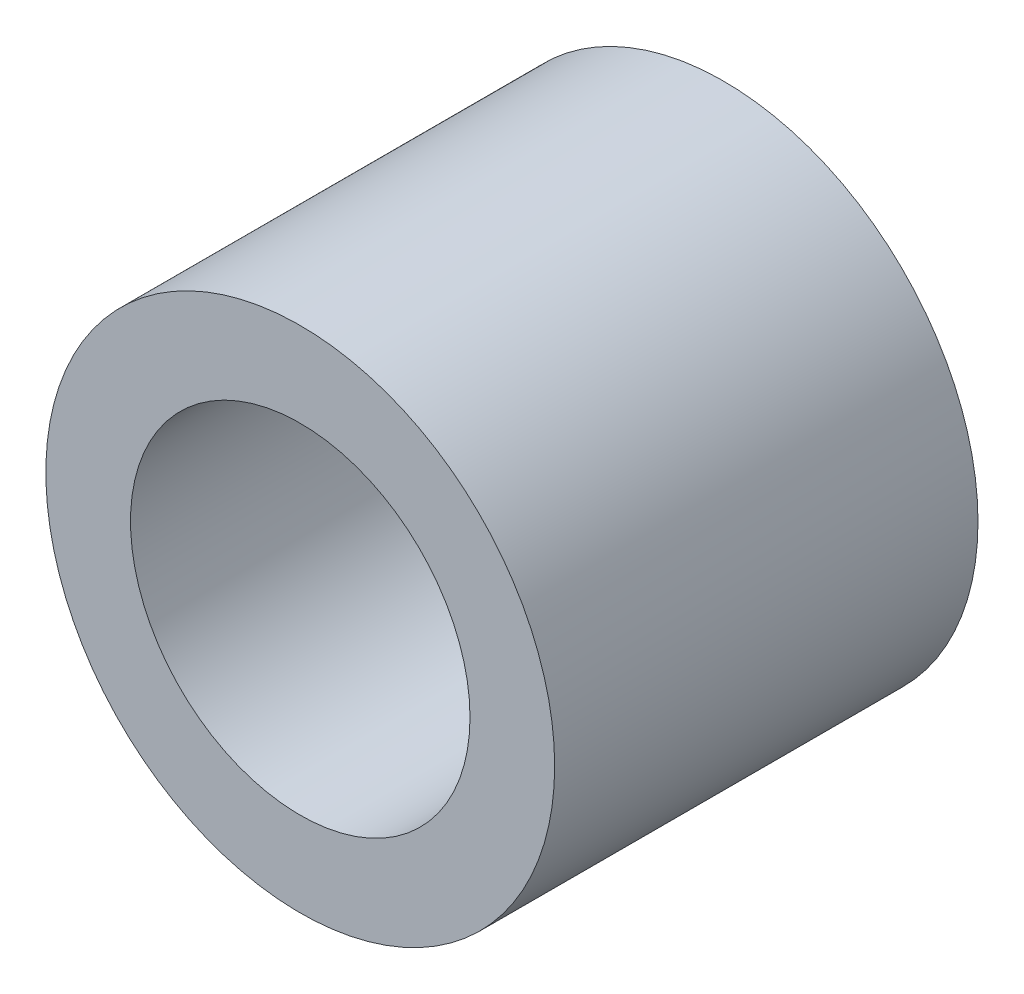
ISO-10303-21;
HEADER;
FILE_DESCRIPTION(('STEP AP214'),'2;1');
FILE_NAME('part.step','',(''),(''),'','','');
FILE_SCHEMA(('AUTOMOTIVE_DESIGN { 1 0 10303 214 1 1 1 1 }'));
ENDSEC;
DATA;
#1=APPLICATION_CONTEXT('core data for automotive mechanical design processes');
#2=APPLICATION_PROTOCOL_DEFINITION('international standard','automotive_design',2000,#1);
#3=PRODUCT_CONTEXT('',#1,'mechanical');
#4=PRODUCT('Part','Part','',(#3));
#5=PRODUCT_RELATED_PRODUCT_CATEGORY('part','',(#4));
#6=PRODUCT_DEFINITION_FORMATION('','',#4);
#7=PRODUCT_DEFINITION_CONTEXT('part definition',#1,'design');
#8=PRODUCT_DEFINITION('design','',#6,#7);
#9=PRODUCT_DEFINITION_SHAPE('','',#8);
#10=(LENGTH_UNIT() NAMED_UNIT(*) SI_UNIT(.MILLI.,.METRE.));
#11=(NAMED_UNIT(*) PLANE_ANGLE_UNIT() SI_UNIT($,.RADIAN.));
#12=(NAMED_UNIT(*) SI_UNIT($,.STERADIAN.) SOLID_ANGLE_UNIT());
#13=UNCERTAINTY_MEASURE_WITH_UNIT(LENGTH_MEASURE(1.E-05),#10,'distance_accuracy_value','');
#14=(GEOMETRIC_REPRESENTATION_CONTEXT(3) GLOBAL_UNCERTAINTY_ASSIGNED_CONTEXT((#13)) GLOBAL_UNIT_ASSIGNED_CONTEXT((#10,
#11,#12)) REPRESENTATION_CONTEXT('',''));
#15=CARTESIAN_POINT('',(0.,0.,0.));
#16=DIRECTION('',(0.,0.,1.));
#17=DIRECTION('',(1.,0.,0.));
#18=AXIS2_PLACEMENT_3D('',#15,#16,#17);
#19=CARTESIAN_POINT('',(0.,0.,50.));
#20=DIRECTION('',(0.,0.,1.));
#21=DIRECTION('',(1.,0.,0.));
#22=AXIS2_PLACEMENT_3D('',#19,#20,#21);
#23=PLANE('',#22);
#24=CARTESIAN_POINT('',(0.,0.,50.));
#25=DIRECTION('',(0.,0.,1.));
#26=DIRECTION('',(1.,0.,0.));
#27=AXIS2_PLACEMENT_3D('',#24,#25,#26);
#28=CIRCLE('',#27,30.05);
#29=CARTESIAN_POINT('',(30.05,0.,50.));
#30=VERTEX_POINT('',#29);
#31=EDGE_CURVE('E10',#30,#30,#28,.T.);
#32=ORIENTED_EDGE('',*,*,#31,.T.);
#33=EDGE_LOOP('',(#32));
#34=FACE_BOUND('',#33,.T.);
#35=CARTESIAN_POINT('',(0.,0.,50.));
#36=DIRECTION('',(0.,0.,1.));
#37=DIRECTION('',(1.,0.,0.));
#38=AXIS2_PLACEMENT_3D('',#35,#36,#37);
#39=CIRCLE('',#38,20.05);
#40=CARTESIAN_POINT('',(20.05,0.,50.));
#41=VERTEX_POINT('',#40);
#42=EDGE_CURVE('E50',#41,#41,#39,.T.);
#43=ORIENTED_EDGE('',*,*,#42,.F.);
#44=EDGE_LOOP('',(#43));
#45=FACE_BOUND('',#44,.T.);
#46=ADVANCED_FACE('F37',(#34,#45),#23,.T.);
#47=CARTESIAN_POINT('',(0.,0.,0.));
#48=DIRECTION('',(0.,0.,1.));
#49=DIRECTION('',(1.,0.,0.));
#50=AXIS2_PLACEMENT_3D('',#47,#48,#49);
#51=PLANE('',#50);
#52=CARTESIAN_POINT('',(0.,0.,0.));
#53=DIRECTION('',(0.,0.,1.));
#54=DIRECTION('',(1.,0.,0.));
#55=AXIS2_PLACEMENT_3D('',#52,#53,#54);
#56=CIRCLE('',#55,30.05);
#57=CARTESIAN_POINT('',(30.05,0.,0.));
#58=VERTEX_POINT('',#57);
#59=EDGE_CURVE('E41',#58,#58,#56,.T.);
#60=ORIENTED_EDGE('',*,*,#59,.F.);
#61=EDGE_LOOP('',(#60));
#62=FACE_BOUND('',#61,.T.);
#63=CARTESIAN_POINT('',(0.,0.,0.));
#64=DIRECTION('',(0.,0.,1.));
#65=DIRECTION('',(1.,0.,0.));
#66=AXIS2_PLACEMENT_3D('',#63,#64,#65);
#67=CIRCLE('',#66,20.05);
#68=CARTESIAN_POINT('',(20.05,0.,0.));
#69=VERTEX_POINT('',#68);
#70=EDGE_CURVE('E52',#69,#69,#67,.T.);
#71=ORIENTED_EDGE('',*,*,#70,.T.);
#72=EDGE_LOOP('',(#71));
#73=FACE_BOUND('',#72,.T.);
#74=ADVANCED_FACE('F64',(#62,#73),#51,.F.);
#75=CARTESIAN_POINT('',(0.,0.,50.));
#76=DIRECTION('',(0.,0.,-1.));
#77=DIRECTION('',(-1.,0.,0.));
#78=AXIS2_PLACEMENT_3D('',#75,#76,#77);
#79=CYLINDRICAL_SURFACE('',#78,30.05);
#80=ORIENTED_EDGE('',*,*,#31,.F.);
#81=EDGE_LOOP('',(#80));
#82=FACE_BOUND('',#81,.T.);
#83=ORIENTED_EDGE('',*,*,#59,.T.);
#84=EDGE_LOOP('',(#83));
#85=FACE_BOUND('',#84,.T.);
#86=ADVANCED_FACE('F39',(#82,#85),#79,.T.);
#87=CARTESIAN_POINT('',(0.,0.,50.));
#88=DIRECTION('',(0.,0.,-1.));
#89=DIRECTION('',(-1.,0.,0.));
#90=AXIS2_PLACEMENT_3D('',#87,#88,#89);
#91=CYLINDRICAL_SURFACE('',#90,20.05);
#92=ORIENTED_EDGE('',*,*,#42,.T.);
#93=EDGE_LOOP('',(#92));
#94=FACE_BOUND('',#93,.T.);
#95=ORIENTED_EDGE('',*,*,#70,.F.);
#96=EDGE_LOOP('',(#95));
#97=FACE_BOUND('',#96,.T.);
#98=ADVANCED_FACE('F60',(#94,#97),#91,.F.);
#99=CLOSED_SHELL('',(#46,#74,#86,#98));
#100=MANIFOLD_SOLID_BREP('B2',#99);
#101=ADVANCED_BREP_SHAPE_REPRESENTATION('',(#18,#100),#14);
#102=SHAPE_DEFINITION_REPRESENTATION(#9,#101);
ENDSEC;
END-ISO-10303-21;
